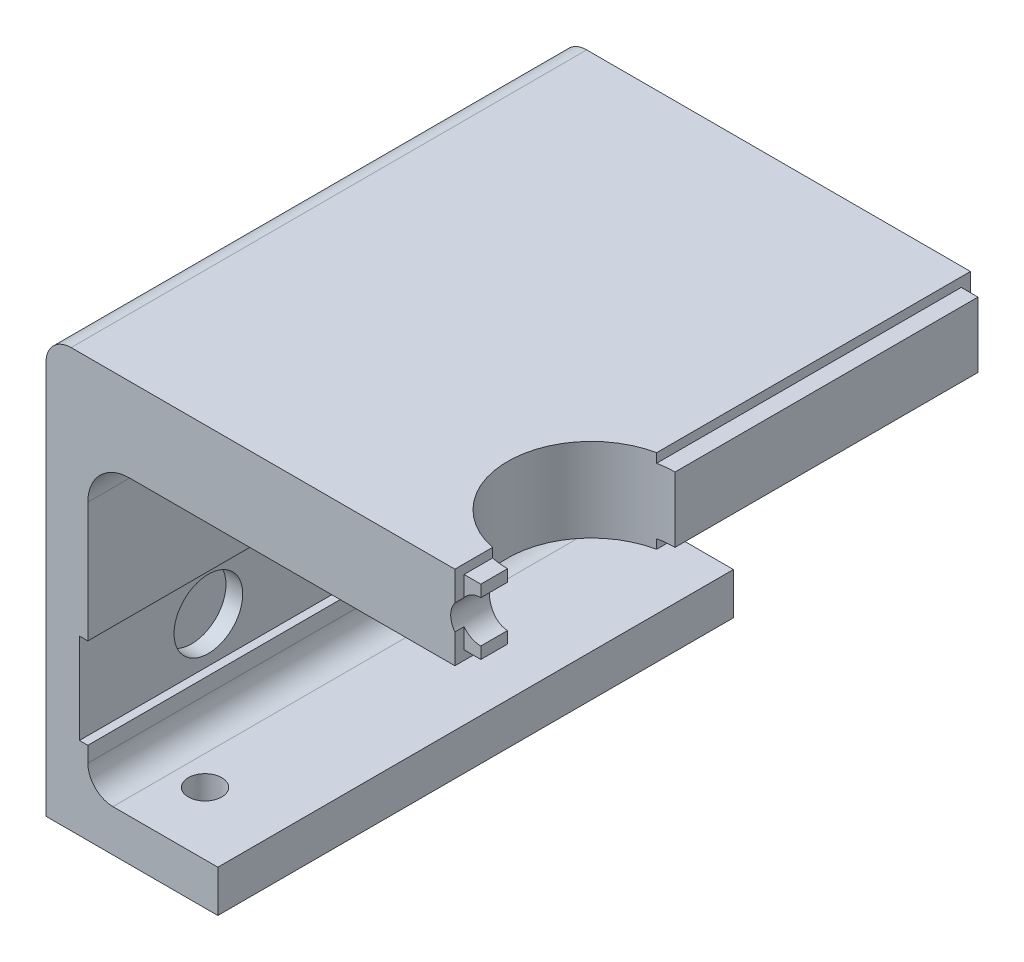
ISO-10303-21;
HEADER;
FILE_DESCRIPTION(('STEP AP214'),'2;1');
FILE_NAME('part.step','',(''),(''),'','','');
FILE_SCHEMA(('AUTOMOTIVE_DESIGN { 1 0 10303 214 1 1 1 1 }'));
ENDSEC;
DATA;
#1=APPLICATION_CONTEXT('core data for automotive mechanical design processes');
#2=APPLICATION_PROTOCOL_DEFINITION('international standard','automotive_design',2000,#1);
#3=PRODUCT_CONTEXT('',#1,'mechanical');
#4=PRODUCT('Part','Part','',(#3));
#5=PRODUCT_RELATED_PRODUCT_CATEGORY('part','',(#4));
#6=PRODUCT_DEFINITION_FORMATION('','',#4);
#7=PRODUCT_DEFINITION_CONTEXT('part definition',#1,'design');
#8=PRODUCT_DEFINITION('design','',#6,#7);
#9=PRODUCT_DEFINITION_SHAPE('','',#8);
#10=(LENGTH_UNIT() NAMED_UNIT(*) SI_UNIT(.MILLI.,.METRE.));
#11=(NAMED_UNIT(*) PLANE_ANGLE_UNIT() SI_UNIT($,.RADIAN.));
#12=(NAMED_UNIT(*) SI_UNIT($,.STERADIAN.) SOLID_ANGLE_UNIT());
#13=UNCERTAINTY_MEASURE_WITH_UNIT(LENGTH_MEASURE(1.E-05),#10,'distance_accuracy_value','');
#14=(GEOMETRIC_REPRESENTATION_CONTEXT(3) GLOBAL_UNCERTAINTY_ASSIGNED_CONTEXT((#13)) GLOBAL_UNIT_ASSIGNED_CONTEXT((#10,
#11,#12)) REPRESENTATION_CONTEXT('',''));
#15=CARTESIAN_POINT('',(0.,0.,0.));
#16=DIRECTION('',(0.,0.,1.));
#17=DIRECTION('',(1.,0.,0.));
#18=AXIS2_PLACEMENT_3D('',#15,#16,#17);
#19=CARTESIAN_POINT('',(0.,0.,0.));
#20=DIRECTION('',(1.,0.,0.));
#21=DIRECTION('',(0.,0.,-1.));
#22=AXIS2_PLACEMENT_3D('',#19,#20,#21);
#23=PLANE('',#22);
#24=DIRECTION('',(0.,1.,0.));
#25=VECTOR('',#24,1.);
#26=CARTESIAN_POINT('',(0.,0.,-10.));
#27=LINE('',#26,#25);
#28=CARTESIAN_POINT('',(0.,8.9,-10.));
#29=VERTEX_POINT('',#28);
#30=CARTESIAN_POINT('',(0.,1.1,-10.));
#31=VERTEX_POINT('',#30);
#32=EDGE_CURVE('E295',#29,#31,#27,.F.);
#33=ORIENTED_EDGE('',*,*,#32,.T.);
#34=DIRECTION('',(0.,0.,-1.));
#35=VECTOR('',#34,1.);
#36=CARTESIAN_POINT('',(0.,1.1,-46.2));
#37=LINE('',#36,#35);
#38=CARTESIAN_POINT('',(0.,1.1,-46.2));
#39=VERTEX_POINT('',#38);
#40=EDGE_CURVE('E256',#31,#39,#37,.T.);
#41=ORIENTED_EDGE('',*,*,#40,.T.);
#42=DIRECTION('',(0.,1.,0.));
#43=VECTOR('',#42,1.);
#44=CARTESIAN_POINT('',(0.,1.1,-46.2));
#45=LINE('',#44,#43);
#46=CARTESIAN_POINT('',(0.,8.90000000000001,-46.2));
#47=VERTEX_POINT('',#46);
#48=EDGE_CURVE('E263',#39,#47,#45,.T.);
#49=ORIENTED_EDGE('',*,*,#48,.T.);
#50=DIRECTION('',(0.,0.,1.));
#51=VECTOR('',#50,1.);
#52=CARTESIAN_POINT('',(0.,8.90000000000001,-46.2));
#53=LINE('',#52,#51);
#54=EDGE_CURVE('E231',#47,#29,#53,.T.);
#55=ORIENTED_EDGE('',*,*,#54,.T.);
#56=EDGE_LOOP('',(#33,#41,#49,#55));
#57=FACE_BOUND('',#56,.T.);
#58=ADVANCED_FACE('F39',(#57),#23,.T.);
#59=CARTESIAN_POINT('',(0.,8.9,10.));
#60=VERTEX_POINT('',#59);
#61=CARTESIAN_POINT('',(0.,8.9,13.2));
#62=VERTEX_POINT('',#61);
#63=EDGE_CURVE('E265',#60,#62,#53,.T.);
#64=ORIENTED_EDGE('',*,*,#63,.T.);
#65=DIRECTION('',(0.,-1.,0.));
#66=VECTOR('',#65,1.);
#67=CARTESIAN_POINT('',(0.,1.09999999999999,13.2));
#68=LINE('',#67,#66);
#69=CARTESIAN_POINT('',(0.,7.5,13.2));
#70=VERTEX_POINT('',#69);
#71=EDGE_CURVE('E268',#62,#70,#68,.T.);
#72=ORIENTED_EDGE('',*,*,#71,.T.);
#73=DIRECTION('',(0.,0.,1.));
#74=VECTOR('',#73,1.);
#75=CARTESIAN_POINT('',(0.,7.5,4.3));
#76=LINE('',#75,#74);
#77=CARTESIAN_POINT('',(0.,7.5,10.));
#78=VERTEX_POINT('',#77);
#79=EDGE_CURVE('E383',#70,#78,#76,.F.);
#80=ORIENTED_EDGE('',*,*,#79,.T.);
#81=DIRECTION('',(0.,1.,0.));
#82=VECTOR('',#81,1.);
#83=CARTESIAN_POINT('',(0.,0.,10.));
#84=LINE('',#83,#82);
#85=EDGE_CURVE('E380',#78,#60,#84,.T.);
#86=ORIENTED_EDGE('',*,*,#85,.T.);
#87=EDGE_LOOP('',(#64,#72,#80,#86));
#88=FACE_BOUND('',#87,.T.);
#89=ADVANCED_FACE('F438',(#88),#23,.T.);
#90=CARTESIAN_POINT('',(0.,2.5,13.2));
#91=VERTEX_POINT('',#90);
#92=CARTESIAN_POINT('',(0.,1.09999999999999,13.2));
#93=VERTEX_POINT('',#92);
#94=EDGE_CURVE('E267',#91,#93,#68,.T.);
#95=ORIENTED_EDGE('',*,*,#94,.T.);
#96=CARTESIAN_POINT('',(0.,1.09999999999999,10.));
#97=VERTEX_POINT('',#96);
#98=EDGE_CURVE('E253',#93,#97,#37,.T.);
#99=ORIENTED_EDGE('',*,*,#98,.T.);
#100=CARTESIAN_POINT('',(0.,2.5,10.));
#101=VERTEX_POINT('',#100);
#102=EDGE_CURVE('E379',#97,#101,#84,.T.);
#103=ORIENTED_EDGE('',*,*,#102,.T.);
#104=DIRECTION('',(0.,0.,1.));
#105=VECTOR('',#104,1.);
#106=CARTESIAN_POINT('',(0.,2.5,4.3));
#107=LINE('',#106,#105);
#108=EDGE_CURVE('E385',#101,#91,#107,.T.);
#109=ORIENTED_EDGE('',*,*,#108,.T.);
#110=EDGE_LOOP('',(#95,#99,#103,#109));
#111=FACE_BOUND('',#110,.T.);
#112=ADVANCED_FACE('F441',(#111),#23,.T.);
#113=CARTESIAN_POINT('',(45.85,10.,14.3));
#114=DIRECTION('',(0.,0.,-1.));
#115=DIRECTION('',(-1.,0.,0.));
#116=AXIS2_PLACEMENT_3D('',#113,#114,#115);
#117=PLANE('',#116);
#118=DIRECTION('',(0.,-1.,0.));
#119=VECTOR('',#118,1.);
#120=CARTESIAN_POINT('',(-2.,0.,14.3));
#121=LINE('',#120,#119);
#122=CARTESIAN_POINT('',(-2.,10.,14.3));
#123=VERTEX_POINT('',#122);
#124=CARTESIAN_POINT('',(-2.,6.5,14.3));
#125=VERTEX_POINT('',#124);
#126=EDGE_CURVE('E276',#123,#125,#121,.T.);
#127=ORIENTED_EDGE('',*,*,#126,.F.);
#128=DIRECTION('',(1.,0.,0.));
#129=VECTOR('',#128,1.);
#130=CARTESIAN_POINT('',(45.85,10.,14.3));
#131=LINE('',#130,#129);
#132=CARTESIAN_POINT('',(-47.85,10.,14.3));
#133=VERTEX_POINT('',#132);
#134=EDGE_CURVE('E389',#133,#123,#131,.T.);
#135=ORIENTED_EDGE('',*,*,#134,.F.);
#136=CARTESIAN_POINT('',(-47.85,7.,14.3));
#137=DIRECTION('',(0.,0.,-1.));
#138=DIRECTION('',(-1.,0.,0.));
#139=AXIS2_PLACEMENT_3D('',#136,#137,#138);
#140=CIRCLE('',#139,3.);
#141=CARTESIAN_POINT('',(-50.85,7.,14.3));
#142=VERTEX_POINT('',#141);
#143=EDGE_CURVE('E501',#133,#142,#140,.F.);
#144=ORIENTED_EDGE('',*,*,#143,.T.);
#145=DIRECTION('',(0.,1.,0.));
#146=VECTOR('',#145,1.);
#147=CARTESIAN_POINT('',(-50.85,-40.,14.3));
#148=LINE('',#147,#146);
#149=CARTESIAN_POINT('',(-50.85,-40.,14.3));
#150=VERTEX_POINT('',#149);
#151=EDGE_CURVE('E312',#150,#142,#148,.T.);
#152=ORIENTED_EDGE('',*,*,#151,.F.);
#153=DIRECTION('',(1.,0.,0.));
#154=VECTOR('',#153,1.);
#155=CARTESIAN_POINT('',(-45.85,-40.,14.3));
#156=LINE('',#155,#154);
#157=CARTESIAN_POINT('',(-30.3206729057567,-40.,14.3));
#158=VERTEX_POINT('',#157);
#159=EDGE_CURVE('E319',#150,#158,#156,.T.);
#160=ORIENTED_EDGE('',*,*,#159,.T.);
#161=DIRECTION('',(0.,-1.,0.));
#162=VECTOR('',#161,1.);
#163=CARTESIAN_POINT('',(-30.3206729057567,-35.,14.3));
#164=LINE('',#163,#162);
#165=CARTESIAN_POINT('',(-30.3206729057567,-35.,14.3));
#166=VERTEX_POINT('',#165);
#167=EDGE_CURVE('E327',#166,#158,#164,.T.);
#168=ORIENTED_EDGE('',*,*,#167,.F.);
#169=DIRECTION('',(-1.,0.,0.));
#170=VECTOR('',#169,1.);
#171=CARTESIAN_POINT('',(-45.85,-35.,14.3));
#172=LINE('',#171,#170);
#173=CARTESIAN_POINT('',(-42.85,-35.,14.3));
#174=VERTEX_POINT('',#173);
#175=EDGE_CURVE('E331',#166,#174,#172,.T.);
#176=ORIENTED_EDGE('',*,*,#175,.T.);
#177=CARTESIAN_POINT('',(-42.85,-32.,14.3));
#178=DIRECTION('',(0.,0.,-1.));
#179=DIRECTION('',(-1.,0.,0.));
#180=AXIS2_PLACEMENT_3D('',#177,#178,#179);
#181=CIRCLE('',#180,3.);
#182=CARTESIAN_POINT('',(-45.85,-32.,14.3));
#183=VERTEX_POINT('',#182);
#184=EDGE_CURVE('E492',#174,#183,#181,.T.);
#185=ORIENTED_EDGE('',*,*,#184,.T.);
#186=DIRECTION('',(0.,1.,0.));
#187=VECTOR('',#186,1.);
#188=CARTESIAN_POINT('',(-45.85,-40.,14.3));
#189=LINE('',#188,#187);
#190=CARTESIAN_POINT('',(-45.85,-30.15,14.3));
#191=VERTEX_POINT('',#190);
#192=EDGE_CURVE('E316',#183,#191,#189,.T.);
#193=ORIENTED_EDGE('',*,*,#192,.T.);
#194=DIRECTION('',(1.,0.,0.));
#195=VECTOR('',#194,1.);
#196=CARTESIAN_POINT('',(-45.85,-30.15,14.3));
#197=LINE('',#196,#195);
#198=CARTESIAN_POINT('',(-46.85,-30.15,14.3));
#199=VERTEX_POINT('',#198);
#200=EDGE_CURVE('E354',#199,#191,#197,.T.);
#201=ORIENTED_EDGE('',*,*,#200,.F.);
#202=DIRECTION('',(0.,-1.,0.));
#203=VECTOR('',#202,1.);
#204=CARTESIAN_POINT('',(-46.85,-30.15,14.3));
#205=LINE('',#204,#203);
#206=CARTESIAN_POINT('',(-46.85,-19.35,14.3));
#207=VERTEX_POINT('',#206);
#208=EDGE_CURVE('E358',#207,#199,#205,.T.);
#209=ORIENTED_EDGE('',*,*,#208,.F.);
#210=DIRECTION('',(-1.,0.,0.));
#211=VECTOR('',#210,1.);
#212=CARTESIAN_POINT('',(-46.85,-19.35,14.3));
#213=LINE('',#212,#211);
#214=CARTESIAN_POINT('',(-45.85,-19.35,14.3));
#215=VERTEX_POINT('',#214);
#216=EDGE_CURVE('E361',#215,#207,#213,.T.);
#217=ORIENTED_EDGE('',*,*,#216,.F.);
#218=CARTESIAN_POINT('',(-45.85,-5.,14.3));
#219=VERTEX_POINT('',#218);
#220=EDGE_CURVE('E315',#215,#219,#189,.T.);
#221=ORIENTED_EDGE('',*,*,#220,.T.);
#222=CARTESIAN_POINT('',(-40.85,-5.,14.3));
#223=DIRECTION('',(0.,0.,-1.));
#224=DIRECTION('',(-1.,0.,0.));
#225=AXIS2_PLACEMENT_3D('',#222,#223,#224);
#226=CIRCLE('',#225,5.);
#227=CARTESIAN_POINT('',(-40.85,0.,14.3));
#228=VERTEX_POINT('',#227);
#229=EDGE_CURVE('E479',#219,#228,#226,.T.);
#230=ORIENTED_EDGE('',*,*,#229,.T.);
#231=DIRECTION('',(1.,0.,0.));
#232=VECTOR('',#231,1.);
#233=CARTESIAN_POINT('',(45.85,0.,14.3));
#234=LINE('',#233,#232);
#235=CARTESIAN_POINT('',(-2.,0.,14.3));
#236=VERTEX_POINT('',#235);
#237=EDGE_CURVE('E394',#228,#236,#234,.T.);
#238=ORIENTED_EDGE('',*,*,#237,.T.);
#239=CARTESIAN_POINT('',(-2.,3.5,14.3));
#240=VERTEX_POINT('',#239);
#241=EDGE_CURVE('E272',#240,#236,#121,.T.);
#242=ORIENTED_EDGE('',*,*,#241,.F.);
#243=CARTESIAN_POINT('',(0.,5.,14.3));
#244=DIRECTION('',(0.,0.,1.));
#245=DIRECTION('',(1.,0.,0.));
#246=AXIS2_PLACEMENT_3D('',#243,#244,#245);
#247=CIRCLE('',#246,2.5);
#248=EDGE_CURVE('E318',#125,#240,#247,.T.);
#249=ORIENTED_EDGE('',*,*,#248,.F.);
#250=EDGE_LOOP('',(#127,#135,#144,#152,#160,#168,#176,#185,#193,#201,#209,#217,#221,#230,#238,
#242,#249));
#251=FACE_BOUND('',#250,.T.);
#252=ADVANCED_FACE('F422',(#251),#117,.F.);
#253=CARTESIAN_POINT('',(-45.85,10.,-47.3));
#254=DIRECTION('',(0.,0.,1.));
#255=DIRECTION('',(1.,0.,0.));
#256=AXIS2_PLACEMENT_3D('',#253,#254,#255);
#257=PLANE('',#256);
#258=DIRECTION('',(0.,1.,0.));
#259=VECTOR('',#258,1.);
#260=CARTESIAN_POINT('',(-2.,0.,-47.2999999999999));
#261=LINE('',#260,#259);
#262=CARTESIAN_POINT('',(-2.,0.,-47.2999999999999));
#263=VERTEX_POINT('',#262);
#264=CARTESIAN_POINT('',(-2.,10.,-47.2999999999999));
#265=VERTEX_POINT('',#264);
#266=EDGE_CURVE('E281',#263,#265,#261,.T.);
#267=ORIENTED_EDGE('',*,*,#266,.F.);
#268=DIRECTION('',(-1.,0.,0.));
#269=VECTOR('',#268,1.);
#270=CARTESIAN_POINT('',(-45.85,0.,-47.3));
#271=LINE('',#270,#269);
#272=CARTESIAN_POINT('',(-40.85,0.,-47.3));
#273=VERTEX_POINT('',#272);
#274=EDGE_CURVE('E392',#263,#273,#271,.T.);
#275=ORIENTED_EDGE('',*,*,#274,.T.);
#276=CARTESIAN_POINT('',(-40.85,-5.,-47.3));
#277=DIRECTION('',(0.,0.,1.));
#278=DIRECTION('',(1.,0.,0.));
#279=AXIS2_PLACEMENT_3D('',#276,#277,#278);
#280=CIRCLE('',#279,5.);
#281=CARTESIAN_POINT('',(-45.85,-5.,-47.3));
#282=VERTEX_POINT('',#281);
#283=EDGE_CURVE('E476',#273,#282,#280,.T.);
#284=ORIENTED_EDGE('',*,*,#283,.T.);
#285=DIRECTION('',(0.,1.,0.));
#286=VECTOR('',#285,1.);
#287=CARTESIAN_POINT('',(-45.85,-40.,-47.3));
#288=LINE('',#287,#286);
#289=CARTESIAN_POINT('',(-45.85,-19.35,-47.3));
#290=VERTEX_POINT('',#289);
#291=EDGE_CURVE('E308',#290,#282,#288,.T.);
#292=ORIENTED_EDGE('',*,*,#291,.F.);
#293=DIRECTION('',(-1.,0.,0.));
#294=VECTOR('',#293,1.);
#295=CARTESIAN_POINT('',(-45.85,-19.35,-47.3));
#296=LINE('',#295,#294);
#297=CARTESIAN_POINT('',(-46.85,-19.35,-47.3));
#298=VERTEX_POINT('',#297);
#299=EDGE_CURVE('E348',#290,#298,#296,.T.);
#300=ORIENTED_EDGE('',*,*,#299,.T.);
#301=DIRECTION('',(0.,-1.,0.));
#302=VECTOR('',#301,1.);
#303=CARTESIAN_POINT('',(-46.85,10.,-47.3));
#304=LINE('',#303,#302);
#305=CARTESIAN_POINT('',(-46.85,-30.15,-47.3));
#306=VERTEX_POINT('',#305);
#307=EDGE_CURVE('E291',#298,#306,#304,.T.);
#308=ORIENTED_EDGE('',*,*,#307,.T.);
#309=DIRECTION('',(1.,0.,0.));
#310=VECTOR('',#309,1.);
#311=CARTESIAN_POINT('',(-45.85,-30.15,-47.3));
#312=LINE('',#311,#310);
#313=CARTESIAN_POINT('',(-45.85,-30.15,-47.3));
#314=VERTEX_POINT('',#313);
#315=EDGE_CURVE('E345',#306,#314,#312,.T.);
#316=ORIENTED_EDGE('',*,*,#315,.T.);
#317=CARTESIAN_POINT('',(-45.85,-32.,-47.3));
#318=VERTEX_POINT('',#317);
#319=EDGE_CURVE('E306',#318,#314,#288,.T.);
#320=ORIENTED_EDGE('',*,*,#319,.F.);
#321=CARTESIAN_POINT('',(-42.85,-32.,-47.3));
#322=DIRECTION('',(0.,0.,1.));
#323=DIRECTION('',(1.,0.,0.));
#324=AXIS2_PLACEMENT_3D('',#321,#322,#323);
#325=CIRCLE('',#324,3.);
#326=CARTESIAN_POINT('',(-42.85,-35.,-47.3));
#327=VERTEX_POINT('',#326);
#328=EDGE_CURVE('E494',#318,#327,#325,.T.);
#329=ORIENTED_EDGE('',*,*,#328,.T.);
#330=DIRECTION('',(1.,0.,0.));
#331=VECTOR('',#330,1.);
#332=CARTESIAN_POINT('',(-30.3206729057567,-35.,-47.3));
#333=LINE('',#332,#331);
#334=CARTESIAN_POINT('',(-30.3206729057567,-35.,-47.3));
#335=VERTEX_POINT('',#334);
#336=EDGE_CURVE('E336',#327,#335,#333,.T.);
#337=ORIENTED_EDGE('',*,*,#336,.T.);
#338=DIRECTION('',(0.,-1.,0.));
#339=VECTOR('',#338,1.);
#340=CARTESIAN_POINT('',(-30.3206729057567,-35.,-47.3));
#341=LINE('',#340,#339);
#342=CARTESIAN_POINT('',(-30.3206729057567,-40.,-47.3));
#343=VERTEX_POINT('',#342);
#344=EDGE_CURVE('E328',#335,#343,#341,.T.);
#345=ORIENTED_EDGE('',*,*,#344,.T.);
#346=DIRECTION('',(-1.,0.,0.));
#347=VECTOR('',#346,1.);
#348=CARTESIAN_POINT('',(-45.85,-40.,-47.3));
#349=LINE('',#348,#347);
#350=CARTESIAN_POINT('',(-50.85,-40.,-47.3));
#351=VERTEX_POINT('',#350);
#352=EDGE_CURVE('E324',#343,#351,#349,.T.);
#353=ORIENTED_EDGE('',*,*,#352,.T.);
#354=DIRECTION('',(0.,1.,0.));
#355=VECTOR('',#354,1.);
#356=CARTESIAN_POINT('',(-50.85,-40.,-47.3));
#357=LINE('',#356,#355);
#358=CARTESIAN_POINT('',(-50.85,7.,-47.3));
#359=VERTEX_POINT('',#358);
#360=EDGE_CURVE('E309',#351,#359,#357,.T.);
#361=ORIENTED_EDGE('',*,*,#360,.T.);
#362=CARTESIAN_POINT('',(-47.85,7.,-47.3));
#363=DIRECTION('',(0.,0.,1.));
#364=DIRECTION('',(1.,0.,0.));
#365=AXIS2_PLACEMENT_3D('',#362,#363,#364);
#366=CIRCLE('',#365,3.);
#367=CARTESIAN_POINT('',(-47.85,10.,-47.3));
#368=VERTEX_POINT('',#367);
#369=EDGE_CURVE('E496',#359,#368,#366,.F.);
#370=ORIENTED_EDGE('',*,*,#369,.T.);
#371=DIRECTION('',(-1.,0.,0.));
#372=VECTOR('',#371,1.);
#373=CARTESIAN_POINT('',(-45.85,10.,-47.3));
#374=LINE('',#373,#372);
#375=EDGE_CURVE('E300',#265,#368,#374,.T.);
#376=ORIENTED_EDGE('',*,*,#375,.F.);
#377=EDGE_LOOP('',(#267,#275,#284,#292,#300,#308,#316,#320,#329,#337,#345,#353,#361,#370,#376));
#378=FACE_BOUND('',#377,.T.);
#379=ADVANCED_FACE('F453',(#378),#257,.F.);
#380=CARTESIAN_POINT('',(0.,10.,0.));
#381=DIRECTION('',(0.,-1.,0.));
#382=DIRECTION('',(0.,0.,-1.));
#383=AXIS2_PLACEMENT_3D('',#380,#381,#382);
#384=PLANE('',#383);
#385=DIRECTION('',(0.,0.,1.));
#386=VECTOR('',#385,1.);
#387=CARTESIAN_POINT('',(-2.,10.,-47.2999999999999));
#388=LINE('',#387,#386);
#389=CARTESIAN_POINT('',(-2.,10.,-9.79795897113271));
#390=VERTEX_POINT('',#389);
#391=EDGE_CURVE('E284',#265,#390,#388,.T.);
#392=ORIENTED_EDGE('',*,*,#391,.F.);
#393=ORIENTED_EDGE('',*,*,#375,.T.);
#394=DIRECTION('',(0.,0.,1.));
#395=VECTOR('',#394,1.);
#396=CARTESIAN_POINT('',(-47.85,10.,14.3));
#397=LINE('',#396,#395);
#398=EDGE_CURVE('E503',#368,#133,#397,.T.);
#399=ORIENTED_EDGE('',*,*,#398,.T.);
#400=ORIENTED_EDGE('',*,*,#134,.T.);
#401=CARTESIAN_POINT('',(-2.,10.,9.79795897113271));
#402=VERTEX_POINT('',#401);
#403=EDGE_CURVE('E283',#402,#123,#388,.T.);
#404=ORIENTED_EDGE('',*,*,#403,.F.);
#405=CARTESIAN_POINT('',(0.,10.,0.));
#406=DIRECTION('',(0.,1.,0.));
#407=DIRECTION('',(0.,0.,1.));
#408=AXIS2_PLACEMENT_3D('',#405,#406,#407);
#409=CIRCLE('',#408,10.);
#410=EDGE_CURVE('E400',#390,#402,#409,.T.);
#411=ORIENTED_EDGE('',*,*,#410,.F.);
#412=EDGE_LOOP('',(#392,#393,#399,#400,#404,#411));
#413=FACE_BOUND('',#412,.T.);
#414=ADVANCED_FACE('F546',(#413),#384,.F.);
#415=CARTESIAN_POINT('',(0.,0.,0.));
#416=DIRECTION('',(0.,-1.,0.));
#417=DIRECTION('',(0.,0.,-1.));
#418=AXIS2_PLACEMENT_3D('',#415,#416,#417);
#419=PLANE('',#418);
#420=ORIENTED_EDGE('',*,*,#274,.F.);
#421=DIRECTION('',(0.,0.,-1.));
#422=VECTOR('',#421,1.);
#423=CARTESIAN_POINT('',(-2.,0.,-47.2999999999999));
#424=LINE('',#423,#422);
#425=CARTESIAN_POINT('',(-2.,0.,-9.79795897113271));
#426=VERTEX_POINT('',#425);
#427=EDGE_CURVE('E278',#426,#263,#424,.T.);
#428=ORIENTED_EDGE('',*,*,#427,.F.);
#429=CARTESIAN_POINT('',(0.,0.,0.));
#430=DIRECTION('',(0.,1.,0.));
#431=DIRECTION('',(0.,0.,1.));
#432=AXIS2_PLACEMENT_3D('',#429,#430,#431);
#433=CIRCLE('',#432,10.);
#434=CARTESIAN_POINT('',(-2.,0.,9.79795897113271));
#435=VERTEX_POINT('',#434);
#436=EDGE_CURVE('E397',#426,#435,#433,.T.);
#437=ORIENTED_EDGE('',*,*,#436,.T.);
#438=EDGE_CURVE('E279',#236,#435,#424,.T.);
#439=ORIENTED_EDGE('',*,*,#438,.F.);
#440=ORIENTED_EDGE('',*,*,#237,.F.);
#441=DIRECTION('',(0.,0.,1.));
#442=VECTOR('',#441,1.);
#443=CARTESIAN_POINT('',(-40.85,0.,-47.3));
#444=LINE('',#443,#442);
#445=EDGE_CURVE('E484',#228,#273,#444,.F.);
#446=ORIENTED_EDGE('',*,*,#445,.T.);
#447=EDGE_LOOP('',(#420,#428,#437,#439,#440,#446));
#448=FACE_BOUND('',#447,.T.);
#449=ADVANCED_FACE('F568',(#448),#419,.T.);
#450=CARTESIAN_POINT('',(0.,0.,0.));
#451=DIRECTION('',(0.,1.,0.));
#452=DIRECTION('',(0.,0.,1.));
#453=AXIS2_PLACEMENT_3D('',#450,#451,#452);
#454=CYLINDRICAL_SURFACE('',#453,10.);
#455=DIRECTION('',(0.,1.,0.));
#456=VECTOR('',#455,1.);
#457=CARTESIAN_POINT('',(-2.,0.,-9.79795897113271));
#458=LINE('',#457,#456);
#459=CARTESIAN_POINT('',(-2.,1.1,-9.79795897113271));
#460=VERTEX_POINT('',#459);
#461=EDGE_CURVE('E289',#460,#426,#458,.F.);
#462=ORIENTED_EDGE('',*,*,#461,.F.);
#463=CARTESIAN_POINT('',(0.,1.09999999999999,0.));
#464=DIRECTION('',(0.,-1.,0.));
#465=DIRECTION('',(0.,0.,-1.));
#466=AXIS2_PLACEMENT_3D('',#463,#464,#465);
#467=CIRCLE('',#466,10.);
#468=EDGE_CURVE('E11',#31,#460,#467,.F.);
#469=ORIENTED_EDGE('',*,*,#468,.F.);
#470=ORIENTED_EDGE('',*,*,#32,.F.);
#471=CARTESIAN_POINT('',(0.,8.9,0.));
#472=DIRECTION('',(0.,1.,0.));
#473=DIRECTION('',(0.,0.,1.));
#474=AXIS2_PLACEMENT_3D('',#471,#472,#473);
#475=CIRCLE('',#474,10.);
#476=CARTESIAN_POINT('',(-2.,8.9,-9.79795897113271));
#477=VERTEX_POINT('',#476);
#478=EDGE_CURVE('E472',#477,#29,#475,.F.);
#479=ORIENTED_EDGE('',*,*,#478,.F.);
#480=EDGE_CURVE('E245',#390,#477,#458,.F.);
#481=ORIENTED_EDGE('',*,*,#480,.F.);
#482=ORIENTED_EDGE('',*,*,#410,.T.);
#483=DIRECTION('',(0.,1.,0.));
#484=VECTOR('',#483,1.);
#485=CARTESIAN_POINT('',(-2.,0.,9.79795897113271));
#486=LINE('',#485,#484);
#487=CARTESIAN_POINT('',(-2.,8.9,9.79795897113271));
#488=VERTEX_POINT('',#487);
#489=EDGE_CURVE('E286',#488,#402,#486,.T.);
#490=ORIENTED_EDGE('',*,*,#489,.F.);
#491=EDGE_CURVE('E560',#60,#488,#475,.F.);
#492=ORIENTED_EDGE('',*,*,#491,.F.);
#493=ORIENTED_EDGE('',*,*,#85,.F.);
#494=CARTESIAN_POINT('',(0.,2.5,10.));
#495=CARTESIAN_POINT('',(0.138126814449552,2.50000387623026,9.99999766446687));
#496=CARTESIAN_POINT('',(0.276296929717938,2.51148591795631,9.99710963553044));
#497=CARTESIAN_POINT('',(0.548677206284221,2.55704191884501,9.98586856383157));
#498=CARTESIAN_POINT('',(0.682885078117899,2.59112868256308,9.97751242366627));
#499=CARTESIAN_POINT('',(0.943368120304295,2.68073208910348,9.9562604388672));
#500=CARTESIAN_POINT('',(1.06965260571667,2.73622299785878,9.94337004736764));
#501=CARTESIAN_POINT('',(1.31112021984071,2.86696898340807,9.91442239679369));
#502=CARTESIAN_POINT('',(1.4263029739146,2.94222472686494,9.89836503090261));
#503=CARTESIAN_POINT('',(1.64466987883486,3.1120013160903,9.86445689319489));
#504=CARTESIAN_POINT('',(1.74759281676843,3.20685262493177,9.84657845246877));
#505=CARTESIAN_POINT('',(1.93624821200553,3.41242034151506,9.8112270019656));
#506=CARTESIAN_POINT('',(2.02197872824865,3.52313853824489,9.79375403816446));
#507=CARTESIAN_POINT('',(2.17504423799829,3.75932537789498,9.76091292830281));
#508=CARTESIAN_POINT('',(2.2420870265419,3.88498871801455,9.74557990774685));
#509=CARTESIAN_POINT('',(2.35399484758457,4.14624735276672,9.71915824696694));
#510=CARTESIAN_POINT('',(2.39886342573357,4.28184105555336,9.70806892824031));
#511=CARTESIAN_POINT('',(2.46425806134127,4.55623916366943,9.69167461160538));
#512=CARTESIAN_POINT('',(2.48525378055342,4.69492482672999,9.68625818328352));
#513=CARTESIAN_POINT('',(2.50376962511068,4.97394761499891,9.68148937432652));
#514=CARTESIAN_POINT('',(2.50129356969685,5.11428446782023,9.68213600713214));
#515=CARTESIAN_POINT('',(2.47331087439951,5.38902634624225,9.68932009194695));
#516=CARTESIAN_POINT('',(2.44836390031772,5.52349270244222,9.69571438345489));
#517=CARTESIAN_POINT('',(2.37704031150499,5.7862684181851,9.71344516118448));
#518=CARTESIAN_POINT('',(2.33066217011566,5.91457733838153,9.72478199948731));
#519=CARTESIAN_POINT('',(2.21731579656198,6.16289669375355,9.75125189842765));
#520=CARTESIAN_POINT('',(2.1501444453882,6.28281028631595,9.76642212449693));
#521=CARTESIAN_POINT('',(1.99726046002491,6.50986451626137,9.79882851409985));
#522=CARTESIAN_POINT('',(1.91154458134806,6.61700291344542,9.81606503891047));
#523=CARTESIAN_POINT('',(1.72110570780204,6.81867269282401,9.85126467566485));
#524=CARTESIAN_POINT('',(1.61591043027644,6.91275748343558,9.86923449130002));
#525=CARTESIAN_POINT('',(1.39101986250617,7.08203540410651,9.90343275964594));
#526=CARTESIAN_POINT('',(1.27132412951324,7.15722795710594,9.91966115915679));
#527=CARTESIAN_POINT('',(1.02019314780232,7.28675097704064,9.94862886823651));
#528=CARTESIAN_POINT('',(0.888718988681042,7.34100890042405,9.96135600212879));
#529=CARTESIAN_POINT('',(0.618126680238141,7.42652884284929,9.98179861652361));
#530=CARTESIAN_POINT('',(0.479009998584144,7.4577952606969,9.98951505565468));
#531=CARTESIAN_POINT('',(0.200899950650048,7.49576260926473,9.99892498785624));
#532=CARTESIAN_POINT('',(0.0619945333136861,7.5030717101255,10.0007675584713));
#533=CARTESIAN_POINT('',(-0.215054791335845,7.49458499657419,9.99864674690754));
#534=CARTESIAN_POINT('',(-0.353198766074324,7.47879126200144,9.99468388736421));
#535=CARTESIAN_POINT('',(-0.622690447960814,7.42504848601437,9.98149301878918));
#536=CARTESIAN_POINT('',(-0.754108531614579,7.38743122753838,9.97234390309647));
#537=CARTESIAN_POINT('',(-1.00876215408752,7.2914881932859,9.94981177723595));
#538=CARTESIAN_POINT('',(-1.13199686505442,7.23316032614463,9.93642833949965));
#539=CARTESIAN_POINT('',(-1.36920522404971,7.09627311854221,9.9065551321037));
#540=CARTESIAN_POINT('',(-1.48297573639294,7.01737314600573,9.89001445610999));
#541=CARTESIAN_POINT('',(-1.69587768940551,6.84201681867139,9.85574181979586));
#542=CARTESIAN_POINT('',(-1.79500659828874,6.74555743397059,9.83800965421578));
#543=CARTESIAN_POINT('',(-1.97831761345414,6.53499673192716,9.80281594932498));
#544=CARTESIAN_POINT('',(-2.06207311270184,6.42052049500074,9.78537173637463));
#545=CARTESIAN_POINT('',(-2.20918459835604,6.17877894255237,9.75321463970069));
#546=CARTESIAN_POINT('',(-2.27254149026901,6.05151419504926,9.73850163474941));
#547=CARTESIAN_POINT('',(-2.37658570101223,5.78849046265627,9.71363491194665));
#548=CARTESIAN_POINT('',(-2.41740732773931,5.65278728614617,9.70345425375809));
#549=CARTESIAN_POINT('',(-2.47557609990489,5.37615060357451,9.68877906706586));
#550=CARTESIAN_POINT('',(-2.49292837912652,5.23521824829759,9.68428329504044));
#551=CARTESIAN_POINT('',(-2.50339765056083,4.95646496023066,9.68158168701612));
#552=CARTESIAN_POINT('',(-2.49719649630131,4.81867094145593,9.68319887888034));
#553=CARTESIAN_POINT('',(-2.46229546385366,4.54616018555623,9.69213181672143));
#554=CARTESIAN_POINT('',(-2.43359603781098,4.41144338664468,9.69944744817731));
#555=CARTESIAN_POINT('',(-2.35488553240495,4.14965256822356,9.71885434473222));
#556=CARTESIAN_POINT('',(-2.30500234113404,4.02253782459945,9.73091692061057));
#557=CARTESIAN_POINT('',(-2.18544152267504,3.77839102881072,9.7584625954084));
#558=CARTESIAN_POINT('',(-2.11576115005696,3.66136037802186,9.77394616867808));
#559=CARTESIAN_POINT('',(-1.95644624772858,3.43740895166324,9.80709390439337));
#560=CARTESIAN_POINT('',(-1.86633860485376,3.33083154429339,9.82480441386302));
#561=CARTESIAN_POINT('',(-1.66964895198289,3.13408825867434,9.86013378743769));
#562=CARTESIAN_POINT('',(-1.56306303543524,3.04392628314506,9.87775262878422));
#563=CARTESIAN_POINT('',(-1.33411264450432,2.88098115239232,9.91129426079449));
#564=CARTESIAN_POINT('',(-1.21149737052731,2.80854231054737,9.92718055609783));
#565=CARTESIAN_POINT('',(-0.955443432517461,2.68542089509912,9.95508208291861));
#566=CARTESIAN_POINT('',(-0.8220126057279,2.63472273225244,9.96710008666301));
#567=CARTESIAN_POINT('',(-0.57401708873912,2.56404694945058,9.98413432609236));
#568=CARTESIAN_POINT('',(-0.460633618180115,2.54008126157761,9.99004308421151));
#569=CARTESIAN_POINT('',(-0.231510119227139,2.5080567606301,9.9979767538658));
#570=CARTESIAN_POINT('',(-0.115770268737694,2.49999675115783,10.0000019575149));
#571=CARTESIAN_POINT('',(0.,2.5,10.));
#572=B_SPLINE_CURVE_WITH_KNOTS('',3,(#494,#495,#496,#497,#498,#499,#500,#501,#502,#503,#504,
#505,#506,#507,#508,#509,#510,#511,#512,#513,#514,#515,#516,#517,#518,#519,#520,#521,#522,#523,
#524,#525,#526,#527,#528,#529,#530,#531,#532,#533,#534,#535,#536,#537,#538,#539,#540,#541,#542,
#543,#544,#545,#546,#547,#548,#549,#550,#551,#552,#553,#554,#555,#556,#557,#558,#559,#560,#561,
#562,#563,#564,#565,#566,#567,#568,#569,#570,#571),.UNSPECIFIED.,.T.,.F.,(4,2,2,2,2,2,2,2,2,2,2,
2,2,2,2,2,2,2,2,2,2,2,2,2,2,2,2,2,2,2,2,2,2,2,2,2,2,2,4),(0.,0.413956187453149,
0.828147062939832,1.24184150381018,1.65554990028221,2.07690725728565,2.4983121596677,
2.92597745909678,3.35357435282281,3.77260491835116,4.19156730193363,4.60037495017231,
5.00921172448932,5.42217546462,5.83521151399139,6.26002501620567,6.6848514926928,
7.11113715020724,7.53734122819939,7.95263848254328,8.36789835193439,8.7770045752893,
9.18615212209352,9.60255979281121,10.0190393835223,10.4457418201299,10.8724253125471,
11.2965375769764,11.7205570543048,12.1323963400748,12.5442273493652,12.9536066760888,
13.3630428023797,13.7831596069298,14.2033761629383,14.6312030917578,15.0587227304538,
15.4057040491338,15.752659267482),.UNSPECIFIED.);
#573=EDGE_CURVE('E403',#78,#101,#572,.T.);
#574=ORIENTED_EDGE('',*,*,#573,.T.);
#575=ORIENTED_EDGE('',*,*,#102,.F.);
#576=CARTESIAN_POINT('',(-2.,1.09999999999999,9.79795897113271));
#577=VERTEX_POINT('',#576);
#578=EDGE_CURVE('E43',#577,#97,#467,.F.);
#579=ORIENTED_EDGE('',*,*,#578,.F.);
#580=EDGE_CURVE('E288',#435,#577,#486,.T.);
#581=ORIENTED_EDGE('',*,*,#580,.F.);
#582=ORIENTED_EDGE('',*,*,#436,.F.);
#583=EDGE_LOOP('',(#462,#469,#470,#479,#481,#482,#490,#492,#493,#574,#575,#579,#581,#582));
#584=FACE_BOUND('',#583,.T.);
#585=ADVANCED_FACE('F412',(#584),#454,.F.);
#586=CARTESIAN_POINT('',(0.,5.,4.3));
#587=DIRECTION('',(0.,0.,1.));
#588=DIRECTION('',(1.,0.,0.));
#589=AXIS2_PLACEMENT_3D('',#586,#587,#588);
#590=CYLINDRICAL_SURFACE('',#589,2.5);
#591=DIRECTION('',(0.,0.,1.));
#592=VECTOR('',#591,1.);
#593=CARTESIAN_POINT('',(-2.,3.5,4.3));
#594=LINE('',#593,#592);
#595=CARTESIAN_POINT('',(-2.,3.5,13.2));
#596=VERTEX_POINT('',#595);
#597=EDGE_CURVE('E468',#596,#240,#594,.T.);
#598=ORIENTED_EDGE('',*,*,#597,.F.);
#599=CARTESIAN_POINT('',(0.,5.,13.2));
#600=DIRECTION('',(0.,0.,1.));
#601=DIRECTION('',(0.,-1.,0.));
#602=AXIS2_PLACEMENT_3D('',#599,#600,#601);
#603=CIRCLE('',#602,2.5);
#604=EDGE_CURVE('E462',#91,#596,#603,.F.);
#605=ORIENTED_EDGE('',*,*,#604,.F.);
#606=ORIENTED_EDGE('',*,*,#108,.F.);
#607=ORIENTED_EDGE('',*,*,#573,.F.);
#608=ORIENTED_EDGE('',*,*,#79,.F.);
#609=CARTESIAN_POINT('',(-2.,6.5,13.2));
#610=VERTEX_POINT('',#609);
#611=EDGE_CURVE('E471',#610,#70,#603,.F.);
#612=ORIENTED_EDGE('',*,*,#611,.F.);
#613=DIRECTION('',(0.,0.,1.));
#614=VECTOR('',#613,1.);
#615=CARTESIAN_POINT('',(-2.,6.5,4.3));
#616=LINE('',#615,#614);
#617=EDGE_CURVE('E469',#125,#610,#616,.F.);
#618=ORIENTED_EDGE('',*,*,#617,.F.);
#619=ORIENTED_EDGE('',*,*,#248,.T.);
#620=EDGE_LOOP('',(#598,#605,#606,#607,#608,#612,#618,#619));
#621=FACE_BOUND('',#620,.T.);
#622=ADVANCED_FACE('F416',(#621),#590,.F.);
#623=CARTESIAN_POINT('',(-45.85,-40.,-47.3));
#624=DIRECTION('',(1.,0.,0.));
#625=DIRECTION('',(0.,0.,-1.));
#626=AXIS2_PLACEMENT_3D('',#623,#624,#625);
#627=PLANE('',#626);
#628=ORIENTED_EDGE('',*,*,#192,.F.);
#629=DIRECTION('',(0.,0.,-1.));
#630=VECTOR('',#629,1.);
#631=CARTESIAN_POINT('',(-45.85,-32.,-47.3));
#632=LINE('',#631,#630);
#633=EDGE_CURVE('E374',#183,#318,#632,.T.);
#634=ORIENTED_EDGE('',*,*,#633,.T.);
#635=ORIENTED_EDGE('',*,*,#319,.T.);
#636=DIRECTION('',(0.,0.,-1.));
#637=VECTOR('',#636,1.);
#638=CARTESIAN_POINT('',(-45.85,-30.15,-47.3));
#639=LINE('',#638,#637);
#640=EDGE_CURVE('E294',#191,#314,#639,.T.);
#641=ORIENTED_EDGE('',*,*,#640,.F.);
#642=EDGE_LOOP('',(#628,#634,#635,#641));
#643=FACE_BOUND('',#642,.T.);
#644=ADVANCED_FACE('F420',(#643),#627,.T.);
#645=ORIENTED_EDGE('',*,*,#291,.T.);
#646=DIRECTION('',(0.,0.,1.));
#647=VECTOR('',#646,1.);
#648=CARTESIAN_POINT('',(-45.85,-5.,14.3));
#649=LINE('',#648,#647);
#650=EDGE_CURVE('E489',#282,#219,#649,.T.);
#651=ORIENTED_EDGE('',*,*,#650,.T.);
#652=ORIENTED_EDGE('',*,*,#220,.F.);
#653=DIRECTION('',(0.,0.,1.));
#654=VECTOR('',#653,1.);
#655=CARTESIAN_POINT('',(-45.85,-19.35,-47.3));
#656=LINE('',#655,#654);
#657=EDGE_CURVE('E298',#290,#215,#656,.T.);
#658=ORIENTED_EDGE('',*,*,#657,.F.);
#659=EDGE_LOOP('',(#645,#651,#652,#658));
#660=FACE_BOUND('',#659,.T.);
#661=ADVANCED_FACE('F577',(#660),#627,.T.);
#662=CARTESIAN_POINT('',(-50.85,-40.,14.3));
#663=DIRECTION('',(-1.,0.,0.));
#664=DIRECTION('',(0.,0.,1.));
#665=AXIS2_PLACEMENT_3D('',#662,#663,#664);
#666=PLANE('',#665);
#667=ORIENTED_EDGE('',*,*,#151,.T.);
#668=DIRECTION('',(0.,0.,1.));
#669=VECTOR('',#668,1.);
#670=CARTESIAN_POINT('',(-50.85,7.,-47.3));
#671=LINE('',#670,#669);
#672=EDGE_CURVE('E499',#142,#359,#671,.F.);
#673=ORIENTED_EDGE('',*,*,#672,.T.);
#674=ORIENTED_EDGE('',*,*,#360,.F.);
#675=DIRECTION('',(0.,0.,1.));
#676=VECTOR('',#675,1.);
#677=CARTESIAN_POINT('',(-50.85,-40.,14.3));
#678=LINE('',#677,#676);
#679=EDGE_CURVE('E321',#351,#150,#678,.T.);
#680=ORIENTED_EDGE('',*,*,#679,.T.);
#681=EDGE_LOOP('',(#667,#673,#674,#680));
#682=FACE_BOUND('',#681,.T.);
#683=ADVANCED_FACE('F803',(#682),#666,.T.);
#684=CARTESIAN_POINT('',(0.,-40.,0.));
#685=DIRECTION('',(0.,-1.,0.));
#686=DIRECTION('',(0.,0.,-1.));
#687=AXIS2_PLACEMENT_3D('',#684,#685,#686);
#688=PLANE('',#687);
#689=CARTESIAN_POINT('',(-39.35,-40.,6.80000000000001));
#690=DIRECTION('',(0.,-1.,0.));
#691=DIRECTION('',(0.,0.,-1.));
#692=AXIS2_PLACEMENT_3D('',#689,#690,#691);
#693=CIRCLE('',#692,2.);
#694=CARTESIAN_POINT('',(-39.35,-40.,4.8));
#695=VERTEX_POINT('',#694);
#696=EDGE_CURVE('E304',#695,#695,#693,.T.);
#697=ORIENTED_EDGE('',*,*,#696,.F.);
#698=EDGE_LOOP('',(#697));
#699=FACE_BOUND('',#698,.T.);
#700=ORIENTED_EDGE('',*,*,#352,.F.);
#701=DIRECTION('',(0.,0.,1.));
#702=VECTOR('',#701,1.);
#703=CARTESIAN_POINT('',(-30.3206729057567,-40.,14.3));
#704=LINE('',#703,#702);
#705=EDGE_CURVE('E305',#343,#158,#704,.T.);
#706=ORIENTED_EDGE('',*,*,#705,.T.);
#707=ORIENTED_EDGE('',*,*,#159,.F.);
#708=ORIENTED_EDGE('',*,*,#679,.F.);
#709=EDGE_LOOP('',(#700,#706,#707,#708));
#710=FACE_BOUND('',#709,.T.);
#711=ADVANCED_FACE('F537',(#699,#710),#688,.T.);
#712=CARTESIAN_POINT('',(-30.3206729057567,-35.,14.3));
#713=DIRECTION('',(1.,0.,0.));
#714=DIRECTION('',(0.,0.,-1.));
#715=AXIS2_PLACEMENT_3D('',#712,#713,#714);
#716=PLANE('',#715);
#717=ORIENTED_EDGE('',*,*,#705,.F.);
#718=ORIENTED_EDGE('',*,*,#344,.F.);
#719=DIRECTION('',(0.,0.,1.));
#720=VECTOR('',#719,1.);
#721=CARTESIAN_POINT('',(-30.3206729057567,-35.,14.3));
#722=LINE('',#721,#720);
#723=EDGE_CURVE('E339',#335,#166,#722,.T.);
#724=ORIENTED_EDGE('',*,*,#723,.T.);
#725=ORIENTED_EDGE('',*,*,#167,.T.);
#726=EDGE_LOOP('',(#717,#718,#724,#725));
#727=FACE_BOUND('',#726,.T.);
#728=ADVANCED_FACE('F534',(#727),#716,.T.);
#729=CARTESIAN_POINT('',(0.,-35.,0.));
#730=DIRECTION('',(0.,1.,0.));
#731=DIRECTION('',(0.,0.,1.));
#732=AXIS2_PLACEMENT_3D('',#729,#730,#731);
#733=PLANE('',#732);
#734=CARTESIAN_POINT('',(-39.35,-35.,6.80000000000001));
#735=DIRECTION('',(0.,1.,0.));
#736=DIRECTION('',(0.,0.,1.));
#737=AXIS2_PLACEMENT_3D('',#734,#735,#736);
#738=CIRCLE('',#737,2.);
#739=CARTESIAN_POINT('',(-39.35,-35.,8.80000000000001));
#740=VERTEX_POINT('',#739);
#741=EDGE_CURVE('E301',#740,#740,#738,.T.);
#742=ORIENTED_EDGE('',*,*,#741,.F.);
#743=EDGE_LOOP('',(#742));
#744=FACE_BOUND('',#743,.T.);
#745=ORIENTED_EDGE('',*,*,#336,.F.);
#746=DIRECTION('',(0.,0.,-1.));
#747=VECTOR('',#746,1.);
#748=CARTESIAN_POINT('',(-42.85,-35.,14.3));
#749=LINE('',#748,#747);
#750=EDGE_CURVE('E506',#327,#174,#749,.F.);
#751=ORIENTED_EDGE('',*,*,#750,.T.);
#752=ORIENTED_EDGE('',*,*,#175,.F.);
#753=ORIENTED_EDGE('',*,*,#723,.F.);
#754=EDGE_LOOP('',(#745,#751,#752,#753));
#755=FACE_BOUND('',#754,.T.);
#756=ADVANCED_FACE('F529',(#744,#755),#733,.T.);
#757=CARTESIAN_POINT('',(-39.35,-30.,6.80000000000001));
#758=DIRECTION('',(0.,-1.,0.));
#759=DIRECTION('',(0.,0.,-1.));
#760=AXIS2_PLACEMENT_3D('',#757,#758,#759);
#761=CYLINDRICAL_SURFACE('',#760,2.);
#762=ORIENTED_EDGE('',*,*,#741,.T.);
#763=EDGE_LOOP('',(#762));
#764=FACE_BOUND('',#763,.T.);
#765=ORIENTED_EDGE('',*,*,#696,.T.);
#766=EDGE_LOOP('',(#765));
#767=FACE_BOUND('',#766,.T.);
#768=ADVANCED_FACE('F593',(#764,#767),#761,.F.);
#769=CARTESIAN_POINT('',(-46.85,-30.15,-85.7));
#770=DIRECTION('',(-1.,0.,0.));
#771=DIRECTION('',(0.,0.,1.));
#772=AXIS2_PLACEMENT_3D('',#769,#770,#771);
#773=PLANE('',#772);
#774=CARTESIAN_POINT('',(-46.85,-24.75,-1.1));
#775=DIRECTION('',(-1.,0.,0.));
#776=DIRECTION('',(0.,0.,1.));
#777=AXIS2_PLACEMENT_3D('',#774,#775,#776);
#778=CIRCLE('',#777,4.10389214822363);
#779=CARTESIAN_POINT('',(-46.85,-24.75,3.00389214822363));
#780=VERTEX_POINT('',#779);
#781=EDGE_CURVE('E364',#780,#780,#778,.F.);
#782=ORIENTED_EDGE('',*,*,#781,.F.);
#783=EDGE_LOOP('',(#782));
#784=FACE_BOUND('',#783,.T.);
#785=CARTESIAN_POINT('',(-46.85,-24.75,-31.9));
#786=DIRECTION('',(-1.,0.,0.));
#787=DIRECTION('',(0.,0.,1.));
#788=AXIS2_PLACEMENT_3D('',#785,#786,#787);
#789=CIRCLE('',#788,4.10389214822363);
#790=CARTESIAN_POINT('',(-46.85,-24.75,-27.7961078517764));
#791=VERTEX_POINT('',#790);
#792=EDGE_CURVE('E367',#791,#791,#789,.F.);
#793=ORIENTED_EDGE('',*,*,#792,.F.);
#794=EDGE_LOOP('',(#793));
#795=FACE_BOUND('',#794,.T.);
#796=DIRECTION('',(0.,0.,1.));
#797=VECTOR('',#796,1.);
#798=CARTESIAN_POINT('',(-46.85,-19.35,-85.7));
#799=LINE('',#798,#797);
#800=EDGE_CURVE('E352',#298,#207,#799,.T.);
#801=ORIENTED_EDGE('',*,*,#800,.T.);
#802=ORIENTED_EDGE('',*,*,#208,.T.);
#803=DIRECTION('',(0.,0.,1.));
#804=VECTOR('',#803,1.);
#805=CARTESIAN_POINT('',(-46.85,-30.15,-85.7));
#806=LINE('',#805,#804);
#807=EDGE_CURVE('E351',#306,#199,#806,.T.);
#808=ORIENTED_EDGE('',*,*,#807,.F.);
#809=ORIENTED_EDGE('',*,*,#307,.F.);
#810=EDGE_LOOP('',(#801,#802,#808,#809));
#811=FACE_BOUND('',#810,.T.);
#812=ADVANCED_FACE('F520',(#784,#795,#811),#773,.F.);
#813=CARTESIAN_POINT('',(-45.85,-30.15,-85.7));
#814=DIRECTION('',(0.,-1.,0.));
#815=DIRECTION('',(0.,0.,-1.));
#816=AXIS2_PLACEMENT_3D('',#813,#814,#815);
#817=PLANE('',#816);
#818=ORIENTED_EDGE('',*,*,#807,.T.);
#819=ORIENTED_EDGE('',*,*,#200,.T.);
#820=ORIENTED_EDGE('',*,*,#640,.T.);
#821=ORIENTED_EDGE('',*,*,#315,.F.);
#822=EDGE_LOOP('',(#818,#819,#820,#821));
#823=FACE_BOUND('',#822,.T.);
#824=ADVANCED_FACE('F518',(#823),#817,.F.);
#825=CARTESIAN_POINT('',(-46.85,-19.35,-85.7));
#826=DIRECTION('',(0.,1.,0.));
#827=DIRECTION('',(0.,0.,1.));
#828=AXIS2_PLACEMENT_3D('',#825,#826,#827);
#829=PLANE('',#828);
#830=ORIENTED_EDGE('',*,*,#657,.T.);
#831=ORIENTED_EDGE('',*,*,#216,.T.);
#832=ORIENTED_EDGE('',*,*,#800,.F.);
#833=ORIENTED_EDGE('',*,*,#299,.F.);
#834=EDGE_LOOP('',(#830,#831,#832,#833));
#835=FACE_BOUND('',#834,.T.);
#836=ADVANCED_FACE('F580',(#835),#829,.F.);
#837=CARTESIAN_POINT('',(48.85,-24.75,-31.9));
#838=DIRECTION('',(-1.,0.,0.));
#839=DIRECTION('',(0.,0.,1.));
#840=AXIS2_PLACEMENT_3D('',#837,#838,#839);
#841=CYLINDRICAL_SURFACE('',#840,4.10389214822363);
#842=CARTESIAN_POINT('',(-48.85,-24.75,-31.9));
#843=DIRECTION('',(1.,0.,0.));
#844=DIRECTION('',(0.,0.,1.));
#845=AXIS2_PLACEMENT_3D('',#842,#843,#844);
#846=CIRCLE('',#845,4.10389214822363);
#847=CARTESIAN_POINT('',(-48.85,-24.75,-27.7961078517764));
#848=VERTEX_POINT('',#847);
#849=EDGE_CURVE('E371',#848,#848,#846,.T.);
#850=ORIENTED_EDGE('',*,*,#849,.F.);
#851=EDGE_LOOP('',(#850));
#852=FACE_BOUND('',#851,.T.);
#853=ORIENTED_EDGE('',*,*,#792,.T.);
#854=EDGE_LOOP('',(#853));
#855=FACE_BOUND('',#854,.T.);
#856=ADVANCED_FACE('F582',(#852,#855),#841,.F.);
#857=CARTESIAN_POINT('',(-48.85,-24.75,-31.9));
#858=DIRECTION('',(-1.,0.,0.));
#859=DIRECTION('',(0.,0.,1.));
#860=AXIS2_PLACEMENT_3D('',#857,#858,#859);
#861=PLANE('',#860);
#862=ORIENTED_EDGE('',*,*,#849,.T.);
#863=EDGE_LOOP('',(#862));
#864=FACE_BOUND('',#863,.T.);
#865=ADVANCED_FACE('F588',(#864),#861,.F.);
#866=CARTESIAN_POINT('',(48.85,-24.75,-1.1));
#867=DIRECTION('',(-1.,0.,0.));
#868=DIRECTION('',(0.,0.,1.));
#869=AXIS2_PLACEMENT_3D('',#866,#867,#868);
#870=CYLINDRICAL_SURFACE('',#869,4.10389214822363);
#871=CARTESIAN_POINT('',(-48.85,-24.75,-1.1));
#872=DIRECTION('',(1.,0.,0.));
#873=DIRECTION('',(0.,0.,-1.));
#874=AXIS2_PLACEMENT_3D('',#871,#872,#873);
#875=CIRCLE('',#874,4.10389214822363);
#876=CARTESIAN_POINT('',(-48.85,-24.75,-5.20389214822363));
#877=VERTEX_POINT('',#876);
#878=EDGE_CURVE('E370',#877,#877,#875,.T.);
#879=ORIENTED_EDGE('',*,*,#878,.F.);
#880=EDGE_LOOP('',(#879));
#881=FACE_BOUND('',#880,.T.);
#882=ORIENTED_EDGE('',*,*,#781,.T.);
#883=EDGE_LOOP('',(#882));
#884=FACE_BOUND('',#883,.T.);
#885=ADVANCED_FACE('F599',(#881,#884),#870,.F.);
#886=CARTESIAN_POINT('',(-48.85,-24.75,-1.1));
#887=DIRECTION('',(1.,0.,0.));
#888=DIRECTION('',(0.,0.,-1.));
#889=AXIS2_PLACEMENT_3D('',#886,#887,#888);
#890=PLANE('',#889);
#891=ORIENTED_EDGE('',*,*,#878,.T.);
#892=EDGE_LOOP('',(#891));
#893=FACE_BOUND('',#892,.T.);
#894=ADVANCED_FACE('F426',(#893),#890,.T.);
#895=CARTESIAN_POINT('',(-42.85,-32.,-47.3));
#896=DIRECTION('',(0.,0.,1.));
#897=DIRECTION('',(1.,0.,0.));
#898=AXIS2_PLACEMENT_3D('',#895,#896,#897);
#899=CYLINDRICAL_SURFACE('',#898,3.);
#900=ORIENTED_EDGE('',*,*,#184,.F.);
#901=ORIENTED_EDGE('',*,*,#750,.F.);
#902=ORIENTED_EDGE('',*,*,#328,.F.);
#903=ORIENTED_EDGE('',*,*,#633,.F.);
#904=EDGE_LOOP('',(#900,#901,#902,#903));
#905=FACE_BOUND('',#904,.T.);
#906=ADVANCED_FACE('F423',(#905),#899,.F.);
#907=CARTESIAN_POINT('',(-47.85,7.,0.));
#908=DIRECTION('',(0.,0.,-1.));
#909=DIRECTION('',(-1.,0.,0.));
#910=AXIS2_PLACEMENT_3D('',#907,#908,#909);
#911=CYLINDRICAL_SURFACE('',#910,3.);
#912=ORIENTED_EDGE('',*,*,#369,.F.);
#913=ORIENTED_EDGE('',*,*,#672,.F.);
#914=ORIENTED_EDGE('',*,*,#143,.F.);
#915=ORIENTED_EDGE('',*,*,#398,.F.);
#916=EDGE_LOOP('',(#912,#913,#914,#915));
#917=FACE_BOUND('',#916,.T.);
#918=ADVANCED_FACE('F425',(#917),#911,.T.);
#919=CARTESIAN_POINT('',(-40.85,-5.,-47.3));
#920=DIRECTION('',(0.,0.,-1.));
#921=DIRECTION('',(-1.,0.,0.));
#922=AXIS2_PLACEMENT_3D('',#919,#920,#921);
#923=CYLINDRICAL_SURFACE('',#922,5.);
#924=ORIENTED_EDGE('',*,*,#283,.F.);
#925=ORIENTED_EDGE('',*,*,#445,.F.);
#926=ORIENTED_EDGE('',*,*,#229,.F.);
#927=ORIENTED_EDGE('',*,*,#650,.F.);
#928=EDGE_LOOP('',(#924,#925,#926,#927));
#929=FACE_BOUND('',#928,.T.);
#930=ADVANCED_FACE('F41',(#929),#923,.F.);
#931=CARTESIAN_POINT('',(-2.,1.09999999999999,13.2));
#932=DIRECTION('',(0.,0.,1.));
#933=DIRECTION('',(0.,-1.,0.));
#934=AXIS2_PLACEMENT_3D('',#931,#932,#933);
#935=PLANE('',#934);
#936=ORIENTED_EDGE('',*,*,#611,.T.);
#937=ORIENTED_EDGE('',*,*,#71,.F.);
#938=DIRECTION('',(1.,0.,0.));
#939=VECTOR('',#938,1.);
#940=CARTESIAN_POINT('',(-2.,8.9,13.2));
#941=LINE('',#940,#939);
#942=CARTESIAN_POINT('',(-2.,8.9,13.2));
#943=VERTEX_POINT('',#942);
#944=EDGE_CURVE('E236',#943,#62,#941,.T.);
#945=ORIENTED_EDGE('',*,*,#944,.F.);
#946=DIRECTION('',(0.,-1.,0.));
#947=VECTOR('',#946,1.);
#948=CARTESIAN_POINT('',(-2.,1.09999999999999,13.2));
#949=LINE('',#948,#947);
#950=EDGE_CURVE('E62',#943,#610,#949,.T.);
#951=ORIENTED_EDGE('',*,*,#950,.T.);
#952=EDGE_LOOP('',(#936,#937,#945,#951));
#953=FACE_BOUND('',#952,.T.);
#954=ADVANCED_FACE('F434',(#953),#935,.T.);
#955=CARTESIAN_POINT('',(-2.,0.,0.));
#956=DIRECTION('',(1.,0.,0.));
#957=DIRECTION('',(0.,0.,-1.));
#958=AXIS2_PLACEMENT_3D('',#955,#956,#957);
#959=PLANE('',#958);
#960=ORIENTED_EDGE('',*,*,#489,.T.);
#961=ORIENTED_EDGE('',*,*,#403,.T.);
#962=ORIENTED_EDGE('',*,*,#126,.T.);
#963=ORIENTED_EDGE('',*,*,#617,.T.);
#964=ORIENTED_EDGE('',*,*,#950,.F.);
#965=DIRECTION('',(0.,0.,1.));
#966=VECTOR('',#965,1.);
#967=CARTESIAN_POINT('',(-2.,8.90000000000001,-46.2));
#968=LINE('',#967,#966);
#969=EDGE_CURVE('E248',#488,#943,#968,.T.);
#970=ORIENTED_EDGE('',*,*,#969,.F.);
#971=EDGE_LOOP('',(#960,#961,#962,#963,#964,#970));
#972=FACE_BOUND('',#971,.T.);
#973=ADVANCED_FACE('F552',(#972),#959,.T.);
#974=CARTESIAN_POINT('',(-2.,8.90000000000001,-46.2));
#975=DIRECTION('',(0.,1.,0.));
#976=DIRECTION('',(0.,0.,1.));
#977=AXIS2_PLACEMENT_3D('',#974,#975,#976);
#978=PLANE('',#977);
#979=ORIENTED_EDGE('',*,*,#491,.T.);
#980=ORIENTED_EDGE('',*,*,#969,.T.);
#981=ORIENTED_EDGE('',*,*,#944,.T.);
#982=ORIENTED_EDGE('',*,*,#63,.F.);
#983=EDGE_LOOP('',(#979,#980,#981,#982));
#984=FACE_BOUND('',#983,.T.);
#985=ADVANCED_FACE('F557',(#984),#978,.T.);
#986=ORIENTED_EDGE('',*,*,#604,.T.);
#987=CARTESIAN_POINT('',(-2.,1.09999999999999,13.2));
#988=VERTEX_POINT('',#987);
#989=EDGE_CURVE('E247',#596,#988,#949,.T.);
#990=ORIENTED_EDGE('',*,*,#989,.T.);
#991=DIRECTION('',(1.,0.,0.));
#992=VECTOR('',#991,1.);
#993=CARTESIAN_POINT('',(-2.,1.09999999999999,13.2));
#994=LINE('',#993,#992);
#995=EDGE_CURVE('E273',#988,#93,#994,.T.);
#996=ORIENTED_EDGE('',*,*,#995,.T.);
#997=ORIENTED_EDGE('',*,*,#94,.F.);
#998=EDGE_LOOP('',(#986,#990,#996,#997));
#999=FACE_BOUND('',#998,.T.);
#1000=ADVANCED_FACE('F461',(#999),#935,.T.);
#1001=ORIENTED_EDGE('',*,*,#580,.T.);
#1002=DIRECTION('',(0.,0.,-1.));
#1003=VECTOR('',#1002,1.);
#1004=CARTESIAN_POINT('',(-2.,1.1,-46.2));
#1005=LINE('',#1004,#1003);
#1006=EDGE_CURVE('E237',#988,#577,#1005,.T.);
#1007=ORIENTED_EDGE('',*,*,#1006,.F.);
#1008=ORIENTED_EDGE('',*,*,#989,.F.);
#1009=ORIENTED_EDGE('',*,*,#597,.T.);
#1010=ORIENTED_EDGE('',*,*,#241,.T.);
#1011=ORIENTED_EDGE('',*,*,#438,.T.);
#1012=EDGE_LOOP('',(#1001,#1007,#1008,#1009,#1010,#1011));
#1013=FACE_BOUND('',#1012,.T.);
#1014=ADVANCED_FACE('F661',(#1013),#959,.T.);
#1015=CARTESIAN_POINT('',(-2.,1.1,-46.2));
#1016=DIRECTION('',(0.,-1.,0.));
#1017=DIRECTION('',(0.,0.,-1.));
#1018=AXIS2_PLACEMENT_3D('',#1015,#1016,#1017);
#1019=PLANE('',#1018);
#1020=ORIENTED_EDGE('',*,*,#578,.T.);
#1021=ORIENTED_EDGE('',*,*,#98,.F.);
#1022=ORIENTED_EDGE('',*,*,#995,.F.);
#1023=ORIENTED_EDGE('',*,*,#1006,.T.);
#1024=EDGE_LOOP('',(#1020,#1021,#1022,#1023));
#1025=FACE_BOUND('',#1024,.T.);
#1026=ADVANCED_FACE('F681',(#1025),#1019,.T.);
#1027=ORIENTED_EDGE('',*,*,#468,.T.);
#1028=CARTESIAN_POINT('',(-2.,1.1,-46.2));
#1029=VERTEX_POINT('',#1028);
#1030=EDGE_CURVE('E260',#460,#1029,#1005,.T.);
#1031=ORIENTED_EDGE('',*,*,#1030,.T.);
#1032=DIRECTION('',(1.,0.,0.));
#1033=VECTOR('',#1032,1.);
#1034=CARTESIAN_POINT('',(-2.,1.1,-46.2));
#1035=LINE('',#1034,#1033);
#1036=EDGE_CURVE('E252',#1029,#39,#1035,.T.);
#1037=ORIENTED_EDGE('',*,*,#1036,.T.);
#1038=ORIENTED_EDGE('',*,*,#40,.F.);
#1039=EDGE_LOOP('',(#1027,#1031,#1037,#1038));
#1040=FACE_BOUND('',#1039,.T.);
#1041=ADVANCED_FACE('F689',(#1040),#1019,.T.);
#1042=ORIENTED_EDGE('',*,*,#478,.T.);
#1043=ORIENTED_EDGE('',*,*,#54,.F.);
#1044=DIRECTION('',(1.,0.,0.));
#1045=VECTOR('',#1044,1.);
#1046=CARTESIAN_POINT('',(-2.,8.90000000000001,-46.2));
#1047=LINE('',#1046,#1045);
#1048=CARTESIAN_POINT('',(-2.,8.90000000000001,-46.2));
#1049=VERTEX_POINT('',#1048);
#1050=EDGE_CURVE('E228',#1049,#47,#1047,.T.);
#1051=ORIENTED_EDGE('',*,*,#1050,.F.);
#1052=EDGE_CURVE('E54',#1049,#477,#968,.T.);
#1053=ORIENTED_EDGE('',*,*,#1052,.T.);
#1054=EDGE_LOOP('',(#1042,#1043,#1051,#1053));
#1055=FACE_BOUND('',#1054,.T.);
#1056=ADVANCED_FACE('F229',(#1055),#978,.T.);
#1057=ORIENTED_EDGE('',*,*,#480,.T.);
#1058=ORIENTED_EDGE('',*,*,#1052,.F.);
#1059=DIRECTION('',(0.,1.,0.));
#1060=VECTOR('',#1059,1.);
#1061=CARTESIAN_POINT('',(-2.,1.1,-46.2));
#1062=LINE('',#1061,#1060);
#1063=EDGE_CURVE('E243',#1029,#1049,#1062,.T.);
#1064=ORIENTED_EDGE('',*,*,#1063,.F.);
#1065=ORIENTED_EDGE('',*,*,#1030,.F.);
#1066=ORIENTED_EDGE('',*,*,#461,.T.);
#1067=ORIENTED_EDGE('',*,*,#427,.T.);
#1068=ORIENTED_EDGE('',*,*,#266,.T.);
#1069=ORIENTED_EDGE('',*,*,#391,.T.);
#1070=EDGE_LOOP('',(#1057,#1058,#1064,#1065,#1066,#1067,#1068,#1069));
#1071=FACE_BOUND('',#1070,.T.);
#1072=ADVANCED_FACE('F241',(#1071),#959,.T.);
#1073=CARTESIAN_POINT('',(-2.,1.1,-46.2));
#1074=DIRECTION('',(0.,0.,-1.));
#1075=DIRECTION('',(-1.,0.,0.));
#1076=AXIS2_PLACEMENT_3D('',#1073,#1074,#1075);
#1077=PLANE('',#1076);
#1078=ORIENTED_EDGE('',*,*,#48,.F.);
#1079=ORIENTED_EDGE('',*,*,#1036,.F.);
#1080=ORIENTED_EDGE('',*,*,#1063,.T.);
#1081=ORIENTED_EDGE('',*,*,#1050,.T.);
#1082=EDGE_LOOP('',(#1078,#1079,#1080,#1081));
#1083=FACE_BOUND('',#1082,.T.);
#1084=ADVANCED_FACE('F251',(#1083),#1077,.T.);
#1085=CLOSED_SHELL('',(#58,#89,#112,#252,#379,#414,#449,#585,#622,#644,#661,#683,#711,#728,#756,
#768,#812,#824,#836,#856,#865,#885,#894,#906,#918,#930,#954,#973,#985,#1000,#1014,#1026,#1041,
#1056,#1072,#1084));
#1086=MANIFOLD_SOLID_BREP('B2',#1085);
#1087=ADVANCED_BREP_SHAPE_REPRESENTATION('',(#18,#1086),#14);
#1088=SHAPE_DEFINITION_REPRESENTATION(#9,#1087);
ENDSEC;
END-ISO-10303-21;
